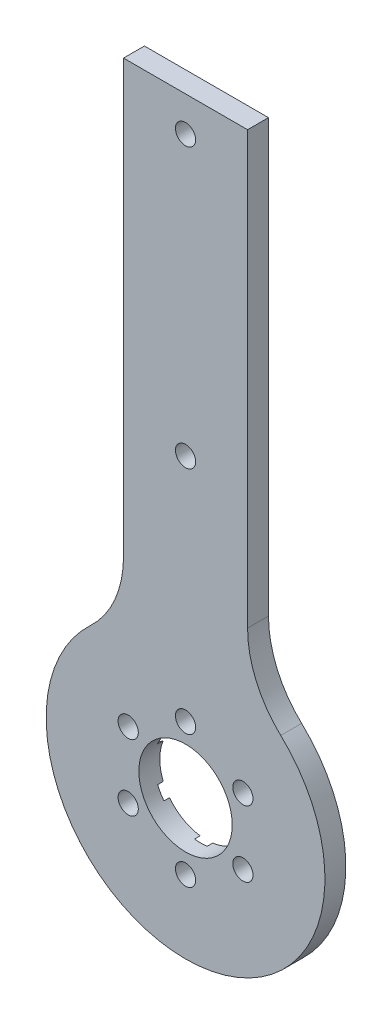
ISO-10303-21;
HEADER;
FILE_DESCRIPTION(('STEP AP214'),'2;1');
FILE_NAME('part.step','',(''),(''),'','','');
FILE_SCHEMA(('AUTOMOTIVE_DESIGN { 1 0 10303 214 1 1 1 1 }'));
ENDSEC;
DATA;
#1=APPLICATION_CONTEXT('core data for automotive mechanical design processes');
#2=APPLICATION_PROTOCOL_DEFINITION('international standard','automotive_design',2000,#1);
#3=PRODUCT_CONTEXT('',#1,'mechanical');
#4=PRODUCT('Part','Part','',(#3));
#5=PRODUCT_RELATED_PRODUCT_CATEGORY('part','',(#4));
#6=PRODUCT_DEFINITION_FORMATION('','',#4);
#7=PRODUCT_DEFINITION_CONTEXT('part definition',#1,'design');
#8=PRODUCT_DEFINITION('design','',#6,#7);
#9=PRODUCT_DEFINITION_SHAPE('','',#8);
#10=(LENGTH_UNIT() NAMED_UNIT(*) SI_UNIT(.MILLI.,.METRE.));
#11=(NAMED_UNIT(*) PLANE_ANGLE_UNIT() SI_UNIT($,.RADIAN.));
#12=(NAMED_UNIT(*) SI_UNIT($,.STERADIAN.) SOLID_ANGLE_UNIT());
#13=UNCERTAINTY_MEASURE_WITH_UNIT(LENGTH_MEASURE(1.E-05),#10,'distance_accuracy_value','');
#14=(GEOMETRIC_REPRESENTATION_CONTEXT(3) GLOBAL_UNCERTAINTY_ASSIGNED_CONTEXT((#13)) GLOBAL_UNIT_ASSIGNED_CONTEXT((#10,
#11,#12)) REPRESENTATION_CONTEXT('',''));
#15=CARTESIAN_POINT('',(0.,0.,0.));
#16=DIRECTION('',(0.,0.,1.));
#17=DIRECTION('',(1.,0.,0.));
#18=AXIS2_PLACEMENT_3D('',#15,#16,#17);
#19=CARTESIAN_POINT('',(0.,9.5,-3.));
#20=DIRECTION('',(0.,0.,1.));
#21=DIRECTION('',(-1.,0.,0.));
#22=AXIS2_PLACEMENT_3D('',#19,#20,#21);
#23=CYLINDRICAL_SURFACE('',#22,1.45);
#24=CARTESIAN_POINT('',(0.,9.5,0.));
#25=DIRECTION('',(0.,0.,1.));
#26=DIRECTION('',(1.,0.,0.));
#27=AXIS2_PLACEMENT_3D('',#24,#25,#26);
#28=CIRCLE('',#27,1.45);
#29=CARTESIAN_POINT('',(1.45,9.5,0.));
#30=VERTEX_POINT('',#29);
#31=EDGE_CURVE('E292',#30,#30,#28,.T.);
#32=ORIENTED_EDGE('',*,*,#31,.T.);
#33=EDGE_LOOP('',(#32));
#34=FACE_BOUND('',#33,.T.);
#35=CARTESIAN_POINT('',(0.,9.5,-2.2));
#36=DIRECTION('',(0.,0.,1.));
#37=DIRECTION('',(1.,0.,0.));
#38=AXIS2_PLACEMENT_3D('',#35,#36,#37);
#39=CIRCLE('',#38,1.45);
#40=CARTESIAN_POINT('',(1.45,9.5,-2.2));
#41=VERTEX_POINT('',#40);
#42=EDGE_CURVE('E239',#41,#41,#39,.T.);
#43=ORIENTED_EDGE('',*,*,#42,.F.);
#44=EDGE_LOOP('',(#43));
#45=FACE_BOUND('',#44,.T.);
#46=ADVANCED_FACE('F43',(#34,#45),#23,.F.);
#47=CARTESIAN_POINT('',(8.22724133595217,4.75,-3.));
#48=DIRECTION('',(0.,0.,1.));
#49=DIRECTION('',(-1.,0.,0.));
#50=AXIS2_PLACEMENT_3D('',#47,#48,#49);
#51=CYLINDRICAL_SURFACE('',#50,1.45);
#52=CARTESIAN_POINT('',(8.22724133595217,4.75,0.));
#53=DIRECTION('',(0.,0.,1.));
#54=DIRECTION('',(1.,0.,0.));
#55=AXIS2_PLACEMENT_3D('',#52,#53,#54);
#56=CIRCLE('',#55,1.45);
#57=CARTESIAN_POINT('',(9.67724133595217,4.75,0.));
#58=VERTEX_POINT('',#57);
#59=EDGE_CURVE('E289',#58,#58,#56,.T.);
#60=ORIENTED_EDGE('',*,*,#59,.T.);
#61=EDGE_LOOP('',(#60));
#62=FACE_BOUND('',#61,.T.);
#63=CARTESIAN_POINT('',(8.22724133595217,4.75,-2.2));
#64=DIRECTION('',(0.,0.,1.));
#65=DIRECTION('',(1.,0.,0.));
#66=AXIS2_PLACEMENT_3D('',#63,#64,#65);
#67=CIRCLE('',#66,1.45);
#68=CARTESIAN_POINT('',(9.67724133595217,4.75,-2.2));
#69=VERTEX_POINT('',#68);
#70=EDGE_CURVE('E236',#69,#69,#67,.T.);
#71=ORIENTED_EDGE('',*,*,#70,.F.);
#72=EDGE_LOOP('',(#71));
#73=FACE_BOUND('',#72,.T.);
#74=ADVANCED_FACE('F392',(#62,#73),#51,.F.);
#75=CARTESIAN_POINT('',(8.22724133595217,-4.75,-3.));
#76=DIRECTION('',(0.,0.,1.));
#77=DIRECTION('',(-1.,0.,0.));
#78=AXIS2_PLACEMENT_3D('',#75,#76,#77);
#79=CYLINDRICAL_SURFACE('',#78,1.45);
#80=CARTESIAN_POINT('',(8.22724133595217,-4.75,0.));
#81=DIRECTION('',(0.,0.,1.));
#82=DIRECTION('',(1.,0.,0.));
#83=AXIS2_PLACEMENT_3D('',#80,#81,#82);
#84=CIRCLE('',#83,1.45);
#85=CARTESIAN_POINT('',(9.67724133595217,-4.75,0.));
#86=VERTEX_POINT('',#85);
#87=EDGE_CURVE('E286',#86,#86,#84,.T.);
#88=ORIENTED_EDGE('',*,*,#87,.T.);
#89=EDGE_LOOP('',(#88));
#90=FACE_BOUND('',#89,.T.);
#91=CARTESIAN_POINT('',(8.22724133595217,-4.75,-2.2));
#92=DIRECTION('',(0.,0.,1.));
#93=DIRECTION('',(1.,0.,0.));
#94=AXIS2_PLACEMENT_3D('',#91,#92,#93);
#95=CIRCLE('',#94,1.45);
#96=CARTESIAN_POINT('',(9.67724133595217,-4.75,-2.2));
#97=VERTEX_POINT('',#96);
#98=EDGE_CURVE('E233',#97,#97,#95,.T.);
#99=ORIENTED_EDGE('',*,*,#98,.F.);
#100=EDGE_LOOP('',(#99));
#101=FACE_BOUND('',#100,.T.);
#102=ADVANCED_FACE('F398',(#90,#101),#79,.F.);
#103=CARTESIAN_POINT('',(0.,-9.5,-3.));
#104=DIRECTION('',(0.,0.,1.));
#105=DIRECTION('',(-1.,0.,0.));
#106=AXIS2_PLACEMENT_3D('',#103,#104,#105);
#107=CYLINDRICAL_SURFACE('',#106,1.45);
#108=CARTESIAN_POINT('',(0.,-9.5,0.));
#109=DIRECTION('',(0.,0.,1.));
#110=DIRECTION('',(1.,0.,0.));
#111=AXIS2_PLACEMENT_3D('',#108,#109,#110);
#112=CIRCLE('',#111,1.45);
#113=CARTESIAN_POINT('',(1.45,-9.5,0.));
#114=VERTEX_POINT('',#113);
#115=EDGE_CURVE('E283',#114,#114,#112,.T.);
#116=ORIENTED_EDGE('',*,*,#115,.T.);
#117=EDGE_LOOP('',(#116));
#118=FACE_BOUND('',#117,.T.);
#119=CARTESIAN_POINT('',(0.,-9.5,-2.2));
#120=DIRECTION('',(0.,0.,1.));
#121=DIRECTION('',(1.,0.,0.));
#122=AXIS2_PLACEMENT_3D('',#119,#120,#121);
#123=CIRCLE('',#122,1.45);
#124=CARTESIAN_POINT('',(1.45,-9.5,-2.2));
#125=VERTEX_POINT('',#124);
#126=EDGE_CURVE('E229',#125,#125,#123,.T.);
#127=ORIENTED_EDGE('',*,*,#126,.F.);
#128=EDGE_LOOP('',(#127));
#129=FACE_BOUND('',#128,.T.);
#130=ADVANCED_FACE('F466',(#118,#129),#107,.F.);
#131=CARTESIAN_POINT('',(-8.22724133595217,-4.75,-3.));
#132=DIRECTION('',(0.,0.,1.));
#133=DIRECTION('',(-1.,0.,0.));
#134=AXIS2_PLACEMENT_3D('',#131,#132,#133);
#135=CYLINDRICAL_SURFACE('',#134,1.45);
#136=CARTESIAN_POINT('',(-8.22724133595217,-4.75,0.));
#137=DIRECTION('',(0.,0.,1.));
#138=DIRECTION('',(1.,0.,0.));
#139=AXIS2_PLACEMENT_3D('',#136,#137,#138);
#140=CIRCLE('',#139,1.45);
#141=CARTESIAN_POINT('',(-6.77724133595216,-4.75,0.));
#142=VERTEX_POINT('',#141);
#143=EDGE_CURVE('E280',#142,#142,#140,.T.);
#144=ORIENTED_EDGE('',*,*,#143,.T.);
#145=EDGE_LOOP('',(#144));
#146=FACE_BOUND('',#145,.T.);
#147=CARTESIAN_POINT('',(-8.22724133595217,-4.75,-2.2));
#148=DIRECTION('',(0.,0.,1.));
#149=DIRECTION('',(1.,0.,0.));
#150=AXIS2_PLACEMENT_3D('',#147,#148,#149);
#151=CIRCLE('',#150,1.45);
#152=CARTESIAN_POINT('',(-6.77724133595216,-4.75,-2.2));
#153=VERTEX_POINT('',#152);
#154=EDGE_CURVE('E225',#153,#153,#151,.T.);
#155=ORIENTED_EDGE('',*,*,#154,.F.);
#156=EDGE_LOOP('',(#155));
#157=FACE_BOUND('',#156,.T.);
#158=ADVANCED_FACE('F462',(#146,#157),#135,.F.);
#159=CARTESIAN_POINT('',(-8.22724133595217,4.75,-3.));
#160=DIRECTION('',(0.,0.,1.));
#161=DIRECTION('',(-1.,0.,0.));
#162=AXIS2_PLACEMENT_3D('',#159,#160,#161);
#163=CYLINDRICAL_SURFACE('',#162,1.45);
#164=CARTESIAN_POINT('',(-8.22724133595217,4.75,0.));
#165=DIRECTION('',(0.,0.,1.));
#166=DIRECTION('',(1.,0.,0.));
#167=AXIS2_PLACEMENT_3D('',#164,#165,#166);
#168=CIRCLE('',#167,1.45);
#169=CARTESIAN_POINT('',(-6.77724133595217,4.75,0.));
#170=VERTEX_POINT('',#169);
#171=EDGE_CURVE('E277',#170,#170,#168,.T.);
#172=ORIENTED_EDGE('',*,*,#171,.T.);
#173=EDGE_LOOP('',(#172));
#174=FACE_BOUND('',#173,.T.);
#175=CARTESIAN_POINT('',(-8.22724133595217,4.75,-2.2));
#176=DIRECTION('',(0.,0.,1.));
#177=DIRECTION('',(1.,0.,0.));
#178=AXIS2_PLACEMENT_3D('',#175,#176,#177);
#179=CIRCLE('',#178,1.45);
#180=CARTESIAN_POINT('',(-6.77724133595217,4.75,-2.2));
#181=VERTEX_POINT('',#180);
#182=EDGE_CURVE('E221',#181,#181,#179,.T.);
#183=ORIENTED_EDGE('',*,*,#182,.F.);
#184=EDGE_LOOP('',(#183));
#185=FACE_BOUND('',#184,.T.);
#186=ADVANCED_FACE('F415',(#174,#185),#163,.F.);
#187=CARTESIAN_POINT('',(0.,0.,-3.));
#188=DIRECTION('',(0.,0.,1.));
#189=DIRECTION('',(-1.,0.,0.));
#190=AXIS2_PLACEMENT_3D('',#187,#188,#189);
#191=CYLINDRICAL_SURFACE('',#190,20.);
#192=CARTESIAN_POINT('',(0.,0.,-3.));
#193=DIRECTION('',(0.,0.,1.));
#194=DIRECTION('',(1.,0.,0.));
#195=AXIS2_PLACEMENT_3D('',#192,#193,#194);
#196=CIRCLE('',#195,20.);
#197=CARTESIAN_POINT('',(-13.6571428571429,14.6110386003046,-3.));
#198=VERTEX_POINT('',#197);
#199=CARTESIAN_POINT('',(13.6571428571429,14.6110386003046,-3.));
#200=VERTEX_POINT('',#199);
#201=EDGE_CURVE('E302',#198,#200,#196,.T.);
#202=ORIENTED_EDGE('',*,*,#201,.T.);
#203=DIRECTION('',(0.,0.,1.));
#204=VECTOR('',#203,1.);
#205=CARTESIAN_POINT('',(13.6571428571429,14.6110386003046,-3.));
#206=LINE('',#205,#204);
#207=CARTESIAN_POINT('',(13.6571428571429,14.6110386003046,0.));
#208=VERTEX_POINT('',#207);
#209=EDGE_CURVE('E310',#208,#200,#206,.F.);
#210=ORIENTED_EDGE('',*,*,#209,.F.);
#211=CARTESIAN_POINT('',(0.,0.,0.));
#212=DIRECTION('',(0.,0.,1.));
#213=DIRECTION('',(1.,0.,0.));
#214=AXIS2_PLACEMENT_3D('',#211,#212,#213);
#215=CIRCLE('',#214,20.);
#216=CARTESIAN_POINT('',(-13.6571428571429,14.6110386003046,0.));
#217=VERTEX_POINT('',#216);
#218=EDGE_CURVE('E306',#217,#208,#215,.T.);
#219=ORIENTED_EDGE('',*,*,#218,.F.);
#220=DIRECTION('',(0.,0.,1.));
#221=VECTOR('',#220,1.);
#222=CARTESIAN_POINT('',(-13.6571428571429,14.6110386003046,-3.));
#223=LINE('',#222,#221);
#224=EDGE_CURVE('E313',#198,#217,#223,.T.);
#225=ORIENTED_EDGE('',*,*,#224,.F.);
#226=EDGE_LOOP('',(#202,#210,#219,#225));
#227=FACE_BOUND('',#226,.T.);
#228=ADVANCED_FACE('F410',(#227),#191,.T.);
#229=CARTESIAN_POINT('',(0.,0.,-3.));
#230=DIRECTION('',(0.,0.,-1.));
#231=DIRECTION('',(1.,0.,0.));
#232=AXIS2_PLACEMENT_3D('',#229,#230,#231);
#233=PLANE('',#232);
#234=CARTESIAN_POINT('',(8.22724133595217,4.75,-3.));
#235=DIRECTION('',(0.,0.,1.));
#236=DIRECTION('',(1.,0.,0.));
#237=AXIS2_PLACEMENT_3D('',#234,#235,#236);
#238=CIRCLE('',#237,3.);
#239=CARTESIAN_POINT('',(6.20071150321712,2.53794737019327,-3.));
#240=VERTEX_POINT('',#239);
#241=CARTESIAN_POINT('',(5.29828264766384,4.10099999822778,-3.));
#242=VERTEX_POINT('',#241);
#243=EDGE_CURVE('E205',#240,#242,#238,.T.);
#244=ORIENTED_EDGE('',*,*,#243,.T.);
#245=CARTESIAN_POINT('',(0.,0.,-3.));
#246=DIRECTION('',(0.,0.,1.));
#247=DIRECTION('',(1.,0.,0.));
#248=AXIS2_PLACEMENT_3D('',#245,#246,#247);
#249=CIRCLE('',#248,6.7);
#250=CARTESIAN_POINT('',(0.902428855553269,6.63894736842105,-3.));
#251=VERTEX_POINT('',#250);
#252=EDGE_CURVE('E299',#242,#251,#249,.T.);
#253=ORIENTED_EDGE('',*,*,#252,.T.);
#254=CARTESIAN_POINT('',(0.,9.5,-3.));
#255=DIRECTION('',(0.,0.,1.));
#256=DIRECTION('',(1.,0.,0.));
#257=AXIS2_PLACEMENT_3D('',#254,#255,#256);
#258=CIRCLE('',#257,3.);
#259=CARTESIAN_POINT('',(-0.902428855553269,6.63894736842105,-3.));
#260=VERTEX_POINT('',#259);
#261=EDGE_CURVE('E207',#251,#260,#258,.T.);
#262=ORIENTED_EDGE('',*,*,#261,.T.);
#263=CARTESIAN_POINT('',(-5.29828264766384,4.10099999822778,-3.));
#264=VERTEX_POINT('',#263);
#265=EDGE_CURVE('E191',#260,#264,#249,.T.);
#266=ORIENTED_EDGE('',*,*,#265,.T.);
#267=CARTESIAN_POINT('',(-8.22724133595217,4.75,-3.));
#268=DIRECTION('',(0.,0.,1.));
#269=DIRECTION('',(1.,0.,0.));
#270=AXIS2_PLACEMENT_3D('',#267,#268,#269);
#271=CIRCLE('',#270,3.);
#272=CARTESIAN_POINT('',(-6.20071150321711,2.53794737019328,-3.));
#273=VERTEX_POINT('',#272);
#274=EDGE_CURVE('E172',#264,#273,#271,.T.);
#275=ORIENTED_EDGE('',*,*,#274,.T.);
#276=CARTESIAN_POINT('',(-6.20071150321711,-2.53794737019328,-3.));
#277=VERTEX_POINT('',#276);
#278=EDGE_CURVE('E182',#273,#277,#249,.T.);
#279=ORIENTED_EDGE('',*,*,#278,.T.);
#280=CARTESIAN_POINT('',(-8.22724133595217,-4.75,-3.));
#281=DIRECTION('',(0.,0.,1.));
#282=DIRECTION('',(1.,0.,0.));
#283=AXIS2_PLACEMENT_3D('',#280,#281,#282);
#284=CIRCLE('',#283,3.);
#285=CARTESIAN_POINT('',(-5.29828264766384,-4.10099999822778,-3.));
#286=VERTEX_POINT('',#285);
#287=EDGE_CURVE('E201',#277,#286,#284,.T.);
#288=ORIENTED_EDGE('',*,*,#287,.T.);
#289=CARTESIAN_POINT('',(-0.902428855553268,-6.63894736842105,-3.));
#290=VERTEX_POINT('',#289);
#291=EDGE_CURVE('E192',#286,#290,#249,.T.);
#292=ORIENTED_EDGE('',*,*,#291,.T.);
#293=CARTESIAN_POINT('',(0.,-9.5,-3.));
#294=DIRECTION('',(0.,0.,1.));
#295=DIRECTION('',(1.,0.,0.));
#296=AXIS2_PLACEMENT_3D('',#293,#294,#295);
#297=CIRCLE('',#296,3.);
#298=CARTESIAN_POINT('',(0.90242885555327,-6.63894736842105,-3.));
#299=VERTEX_POINT('',#298);
#300=EDGE_CURVE('E213',#290,#299,#297,.T.);
#301=ORIENTED_EDGE('',*,*,#300,.T.);
#302=CARTESIAN_POINT('',(5.29828264766384,-4.10099999822778,-3.));
#303=VERTEX_POINT('',#302);
#304=EDGE_CURVE('E298',#299,#303,#249,.T.);
#305=ORIENTED_EDGE('',*,*,#304,.T.);
#306=CARTESIAN_POINT('',(8.22724133595217,-4.75,-3.));
#307=DIRECTION('',(0.,0.,1.));
#308=DIRECTION('',(1.,0.,0.));
#309=AXIS2_PLACEMENT_3D('',#306,#307,#308);
#310=CIRCLE('',#309,3.);
#311=CARTESIAN_POINT('',(6.20071150321712,-2.53794737019327,-3.));
#312=VERTEX_POINT('',#311);
#313=EDGE_CURVE('E209',#303,#312,#310,.T.);
#314=ORIENTED_EDGE('',*,*,#313,.T.);
#315=EDGE_CURVE('E295',#312,#240,#249,.T.);
#316=ORIENTED_EDGE('',*,*,#315,.T.);
#317=EDGE_LOOP('',(#244,#253,#262,#266,#275,#279,#288,#292,#301,#305,#314,#316));
#318=FACE_BOUND('',#317,.T.);
#319=DIRECTION('',(0.,-1.,0.));
#320=VECTOR('',#319,1.);
#321=CARTESIAN_POINT('',(-8.9,12.5,-3.));
#322=LINE('',#321,#320);
#323=CARTESIAN_POINT('',(-8.9,87.5,-3.));
#324=VERTEX_POINT('',#323);
#325=CARTESIAN_POINT('',(-8.9,25.5693175505331,-3.));
#326=VERTEX_POINT('',#325);
#327=EDGE_CURVE('E263',#324,#326,#322,.T.);
#328=ORIENTED_EDGE('',*,*,#327,.F.);
#329=DIRECTION('',(-1.,0.,0.));
#330=VECTOR('',#329,1.);
#331=CARTESIAN_POINT('',(-8.9,87.5,-3.));
#332=LINE('',#331,#330);
#333=CARTESIAN_POINT('',(8.9,87.5,-3.));
#334=VERTEX_POINT('',#333);
#335=EDGE_CURVE('E259',#334,#324,#332,.T.);
#336=ORIENTED_EDGE('',*,*,#335,.F.);
#337=DIRECTION('',(0.,1.,0.));
#338=VECTOR('',#337,1.);
#339=CARTESIAN_POINT('',(8.9,12.5,-3.));
#340=LINE('',#339,#338);
#341=CARTESIAN_POINT('',(8.9,25.5693175505331,-3.));
#342=VERTEX_POINT('',#341);
#343=EDGE_CURVE('E256',#342,#334,#340,.T.);
#344=ORIENTED_EDGE('',*,*,#343,.F.);
#345=CARTESIAN_POINT('',(23.9,25.5693175505331,-3.));
#346=DIRECTION('',(0.,0.,1.));
#347=DIRECTION('',(1.,0.,0.));
#348=AXIS2_PLACEMENT_3D('',#345,#346,#347);
#349=CIRCLE('',#348,15.);
#350=EDGE_CURVE('E325',#200,#342,#349,.F.);
#351=ORIENTED_EDGE('',*,*,#350,.F.);
#352=ORIENTED_EDGE('',*,*,#201,.F.);
#353=CARTESIAN_POINT('',(-23.9,25.5693175505331,-3.));
#354=DIRECTION('',(0.,0.,1.));
#355=DIRECTION('',(1.,0.,0.));
#356=AXIS2_PLACEMENT_3D('',#353,#354,#355);
#357=CIRCLE('',#356,15.);
#358=EDGE_CURVE('E318',#326,#198,#357,.F.);
#359=ORIENTED_EDGE('',*,*,#358,.F.);
#360=EDGE_LOOP('',(#328,#336,#344,#351,#352,#359));
#361=FACE_BOUND('',#360,.T.);
#362=CARTESIAN_POINT('',(0.,42.5,-3.));
#363=DIRECTION('',(0.,0.,1.));
#364=DIRECTION('',(1.,0.,0.));
#365=AXIS2_PLACEMENT_3D('',#362,#363,#364);
#366=CIRCLE('',#365,1.45);
#367=CARTESIAN_POINT('',(1.45,42.5,-3.));
#368=VERTEX_POINT('',#367);
#369=EDGE_CURVE('E250',#368,#368,#366,.T.);
#370=ORIENTED_EDGE('',*,*,#369,.T.);
#371=EDGE_LOOP('',(#370));
#372=FACE_BOUND('',#371,.T.);
#373=CARTESIAN_POINT('',(0.,82.5,-3.));
#374=DIRECTION('',(0.,0.,1.));
#375=DIRECTION('',(1.,0.,0.));
#376=AXIS2_PLACEMENT_3D('',#373,#374,#375);
#377=CIRCLE('',#376,1.45);
#378=CARTESIAN_POINT('',(1.45,82.5,-3.));
#379=VERTEX_POINT('',#378);
#380=EDGE_CURVE('E244',#379,#379,#377,.T.);
#381=ORIENTED_EDGE('',*,*,#380,.T.);
#382=EDGE_LOOP('',(#381));
#383=FACE_BOUND('',#382,.T.);
#384=ADVANCED_FACE('F195',(#318,#361,#372,#383),#233,.T.);
#385=CARTESIAN_POINT('',(0.,0.,0.));
#386=DIRECTION('',(0.,0.,-1.));
#387=DIRECTION('',(1.,0.,0.));
#388=AXIS2_PLACEMENT_3D('',#385,#386,#387);
#389=PLANE('',#388);
#390=ORIENTED_EDGE('',*,*,#218,.T.);
#391=CARTESIAN_POINT('',(23.9,25.5693175505331,0.));
#392=DIRECTION('',(0.,0.,1.));
#393=DIRECTION('',(1.,0.,0.));
#394=AXIS2_PLACEMENT_3D('',#391,#392,#393);
#395=CIRCLE('',#394,15.);
#396=CARTESIAN_POINT('',(8.9,25.5693175505331,0.));
#397=VERTEX_POINT('',#396);
#398=EDGE_CURVE('E323',#397,#208,#395,.T.);
#399=ORIENTED_EDGE('',*,*,#398,.F.);
#400=DIRECTION('',(0.,1.,0.));
#401=VECTOR('',#400,1.);
#402=CARTESIAN_POINT('',(8.9,12.5,0.));
#403=LINE('',#402,#401);
#404=CARTESIAN_POINT('',(8.9,87.5,0.));
#405=VERTEX_POINT('',#404);
#406=EDGE_CURVE('E253',#397,#405,#403,.T.);
#407=ORIENTED_EDGE('',*,*,#406,.T.);
#408=DIRECTION('',(-1.,0.,0.));
#409=VECTOR('',#408,1.);
#410=CARTESIAN_POINT('',(-8.9,87.5,0.));
#411=LINE('',#410,#409);
#412=CARTESIAN_POINT('',(-8.9,87.5,0.));
#413=VERTEX_POINT('',#412);
#414=EDGE_CURVE('E269',#405,#413,#411,.T.);
#415=ORIENTED_EDGE('',*,*,#414,.T.);
#416=DIRECTION('',(0.,-1.,0.));
#417=VECTOR('',#416,1.);
#418=CARTESIAN_POINT('',(-8.9,12.5,0.));
#419=LINE('',#418,#417);
#420=CARTESIAN_POINT('',(-8.9,25.5693175505331,0.));
#421=VERTEX_POINT('',#420);
#422=EDGE_CURVE('E260',#413,#421,#419,.T.);
#423=ORIENTED_EDGE('',*,*,#422,.T.);
#424=CARTESIAN_POINT('',(-23.9,25.5693175505331,0.));
#425=DIRECTION('',(0.,0.,1.));
#426=DIRECTION('',(1.,0.,0.));
#427=AXIS2_PLACEMENT_3D('',#424,#425,#426);
#428=CIRCLE('',#427,15.);
#429=EDGE_CURVE('E320',#217,#421,#428,.T.);
#430=ORIENTED_EDGE('',*,*,#429,.F.);
#431=EDGE_LOOP('',(#390,#399,#407,#415,#423,#430));
#432=FACE_BOUND('',#431,.T.);
#433=CARTESIAN_POINT('',(0.,42.5,0.));
#434=DIRECTION('',(0.,0.,1.));
#435=DIRECTION('',(1.,0.,0.));
#436=AXIS2_PLACEMENT_3D('',#433,#434,#435);
#437=CIRCLE('',#436,1.45);
#438=CARTESIAN_POINT('',(1.45,42.5,0.));
#439=VERTEX_POINT('',#438);
#440=EDGE_CURVE('E247',#439,#439,#437,.T.);
#441=ORIENTED_EDGE('',*,*,#440,.F.);
#442=EDGE_LOOP('',(#441));
#443=FACE_BOUND('',#442,.T.);
#444=CARTESIAN_POINT('',(0.,82.5,0.));
#445=DIRECTION('',(0.,0.,1.));
#446=DIRECTION('',(1.,0.,0.));
#447=AXIS2_PLACEMENT_3D('',#444,#445,#446);
#448=CIRCLE('',#447,1.45);
#449=CARTESIAN_POINT('',(1.45,82.5,0.));
#450=VERTEX_POINT('',#449);
#451=EDGE_CURVE('E243',#450,#450,#448,.T.);
#452=ORIENTED_EDGE('',*,*,#451,.F.);
#453=EDGE_LOOP('',(#452));
#454=FACE_BOUND('',#453,.T.);
#455=ORIENTED_EDGE('',*,*,#171,.F.);
#456=EDGE_LOOP('',(#455));
#457=FACE_BOUND('',#456,.T.);
#458=ORIENTED_EDGE('',*,*,#143,.F.);
#459=EDGE_LOOP('',(#458));
#460=FACE_BOUND('',#459,.T.);
#461=ORIENTED_EDGE('',*,*,#115,.F.);
#462=EDGE_LOOP('',(#461));
#463=FACE_BOUND('',#462,.T.);
#464=ORIENTED_EDGE('',*,*,#87,.F.);
#465=EDGE_LOOP('',(#464));
#466=FACE_BOUND('',#465,.T.);
#467=ORIENTED_EDGE('',*,*,#59,.F.);
#468=EDGE_LOOP('',(#467));
#469=FACE_BOUND('',#468,.T.);
#470=ORIENTED_EDGE('',*,*,#31,.F.);
#471=EDGE_LOOP('',(#470));
#472=FACE_BOUND('',#471,.T.);
#473=CARTESIAN_POINT('',(0.,0.,0.));
#474=DIRECTION('',(0.,0.,1.));
#475=DIRECTION('',(1.,0.,0.));
#476=AXIS2_PLACEMENT_3D('',#473,#474,#475);
#477=CIRCLE('',#476,6.7);
#478=CARTESIAN_POINT('',(6.7,0.,0.));
#479=VERTEX_POINT('',#478);
#480=EDGE_CURVE('E294',#479,#479,#477,.T.);
#481=ORIENTED_EDGE('',*,*,#480,.F.);
#482=EDGE_LOOP('',(#481));
#483=FACE_BOUND('',#482,.T.);
#484=ADVANCED_FACE('F407',(#432,#443,#454,#457,#460,#463,#466,#469,#472,#483),#389,.F.);
#485=CARTESIAN_POINT('',(0.,0.,-3.));
#486=DIRECTION('',(0.,0.,1.));
#487=DIRECTION('',(-1.,0.,0.));
#488=AXIS2_PLACEMENT_3D('',#485,#486,#487);
#489=CYLINDRICAL_SURFACE('',#488,6.7);
#490=DIRECTION('',(0.,0.,-1.));
#491=VECTOR('',#490,1.);
#492=CARTESIAN_POINT('',(6.20071150321712,2.53794737019327,-2.6));
#493=LINE('',#492,#491);
#494=CARTESIAN_POINT('',(6.20071150321712,2.53794737019327,-2.2));
#495=VERTEX_POINT('',#494);
#496=EDGE_CURVE('E11',#495,#240,#493,.T.);
#497=ORIENTED_EDGE('',*,*,#496,.T.);
#498=ORIENTED_EDGE('',*,*,#315,.F.);
#499=DIRECTION('',(0.,0.,-1.));
#500=VECTOR('',#499,1.);
#501=CARTESIAN_POINT('',(6.20071150321712,-2.53794737019327,-2.6));
#502=LINE('',#501,#500);
#503=CARTESIAN_POINT('',(6.20071150321712,-2.53794737019327,-2.2));
#504=VERTEX_POINT('',#503);
#505=EDGE_CURVE('E354',#312,#504,#502,.F.);
#506=ORIENTED_EDGE('',*,*,#505,.T.);
#507=CARTESIAN_POINT('',(0.,0.,-2.2));
#508=DIRECTION('',(0.,0.,1.));
#509=DIRECTION('',(1.,0.,0.));
#510=AXIS2_PLACEMENT_3D('',#507,#508,#509);
#511=CIRCLE('',#510,6.7);
#512=CARTESIAN_POINT('',(5.29828264766384,-4.10099999822778,-2.2));
#513=VERTEX_POINT('',#512);
#514=EDGE_CURVE('E234',#513,#504,#511,.T.);
#515=ORIENTED_EDGE('',*,*,#514,.F.);
#516=DIRECTION('',(0.,0.,-1.));
#517=VECTOR('',#516,1.);
#518=CARTESIAN_POINT('',(5.29828264766384,-4.10099999822778,-2.6));
#519=LINE('',#518,#517);
#520=EDGE_CURVE('E357',#513,#303,#519,.T.);
#521=ORIENTED_EDGE('',*,*,#520,.T.);
#522=ORIENTED_EDGE('',*,*,#304,.F.);
#523=DIRECTION('',(0.,0.,-1.));
#524=VECTOR('',#523,1.);
#525=CARTESIAN_POINT('',(0.902428855553269,-6.63894736842105,-2.6));
#526=LINE('',#525,#524);
#527=CARTESIAN_POINT('',(0.90242885555327,-6.63894736842105,-2.2));
#528=VERTEX_POINT('',#527);
#529=EDGE_CURVE('E349',#299,#528,#526,.F.);
#530=ORIENTED_EDGE('',*,*,#529,.T.);
#531=CARTESIAN_POINT('',(0.,0.,-2.2));
#532=DIRECTION('',(0.,0.,1.));
#533=DIRECTION('',(1.,0.,0.));
#534=AXIS2_PLACEMENT_3D('',#531,#532,#533);
#535=CIRCLE('',#534,6.7);
#536=CARTESIAN_POINT('',(-0.902428855553268,-6.63894736842105,-2.2));
#537=VERTEX_POINT('',#536);
#538=EDGE_CURVE('E230',#537,#528,#535,.T.);
#539=ORIENTED_EDGE('',*,*,#538,.F.);
#540=DIRECTION('',(0.,0.,-1.));
#541=VECTOR('',#540,1.);
#542=CARTESIAN_POINT('',(-0.902428855553267,-6.63894736842105,-2.6));
#543=LINE('',#542,#541);
#544=EDGE_CURVE('E352',#537,#290,#543,.T.);
#545=ORIENTED_EDGE('',*,*,#544,.T.);
#546=ORIENTED_EDGE('',*,*,#291,.F.);
#547=DIRECTION('',(0.,0.,-1.));
#548=VECTOR('',#547,1.);
#549=CARTESIAN_POINT('',(-5.29828264766384,-4.10099999822778,-2.6));
#550=LINE('',#549,#548);
#551=CARTESIAN_POINT('',(-5.29828264766384,-4.10099999822778,-2.2));
#552=VERTEX_POINT('',#551);
#553=EDGE_CURVE('E345',#286,#552,#550,.F.);
#554=ORIENTED_EDGE('',*,*,#553,.T.);
#555=CARTESIAN_POINT('',(0.,0.,-2.2));
#556=DIRECTION('',(0.,0.,1.));
#557=DIRECTION('',(1.,0.,0.));
#558=AXIS2_PLACEMENT_3D('',#555,#556,#557);
#559=CIRCLE('',#558,6.7);
#560=CARTESIAN_POINT('',(-6.20071150321711,-2.53794737019328,-2.2));
#561=VERTEX_POINT('',#560);
#562=EDGE_CURVE('E226',#561,#552,#559,.T.);
#563=ORIENTED_EDGE('',*,*,#562,.F.);
#564=DIRECTION('',(0.,0.,-1.));
#565=VECTOR('',#564,1.);
#566=CARTESIAN_POINT('',(-6.20071150321711,-2.53794737019328,-2.6));
#567=LINE('',#566,#565);
#568=EDGE_CURVE('E187',#561,#277,#567,.T.);
#569=ORIENTED_EDGE('',*,*,#568,.T.);
#570=ORIENTED_EDGE('',*,*,#278,.F.);
#571=DIRECTION('',(0.,0.,-1.));
#572=VECTOR('',#571,1.);
#573=CARTESIAN_POINT('',(-6.20071150321711,2.53794737019328,-2.6));
#574=LINE('',#573,#572);
#575=CARTESIAN_POINT('',(-6.20071150321711,2.53794737019328,-2.2));
#576=VERTEX_POINT('',#575);
#577=EDGE_CURVE('E167',#273,#576,#574,.F.);
#578=ORIENTED_EDGE('',*,*,#577,.T.);
#579=CARTESIAN_POINT('',(0.,0.,-2.2));
#580=DIRECTION('',(0.,0.,1.));
#581=DIRECTION('',(1.,0.,0.));
#582=AXIS2_PLACEMENT_3D('',#579,#580,#581);
#583=CIRCLE('',#582,6.7);
#584=CARTESIAN_POINT('',(-5.29828264766384,4.10099999822778,-2.2));
#585=VERTEX_POINT('',#584);
#586=EDGE_CURVE('E223',#585,#576,#583,.T.);
#587=ORIENTED_EDGE('',*,*,#586,.F.);
#588=DIRECTION('',(0.,0.,-1.));
#589=VECTOR('',#588,1.);
#590=CARTESIAN_POINT('',(-5.29828264766384,4.10099999822777,-2.6));
#591=LINE('',#590,#589);
#592=EDGE_CURVE('E178',#585,#264,#591,.T.);
#593=ORIENTED_EDGE('',*,*,#592,.T.);
#594=ORIENTED_EDGE('',*,*,#265,.F.);
#595=DIRECTION('',(0.,0.,-1.));
#596=VECTOR('',#595,1.);
#597=CARTESIAN_POINT('',(-0.902428855553271,6.63894736842105,-2.6));
#598=LINE('',#597,#596);
#599=CARTESIAN_POINT('',(-0.902428855553269,6.63894736842105,-2.2));
#600=VERTEX_POINT('',#599);
#601=EDGE_CURVE('E328',#260,#600,#598,.F.);
#602=ORIENTED_EDGE('',*,*,#601,.T.);
#603=CARTESIAN_POINT('',(0.,0.,-2.2));
#604=DIRECTION('',(0.,0.,1.));
#605=DIRECTION('',(1.,0.,0.));
#606=AXIS2_PLACEMENT_3D('',#603,#604,#605);
#607=CIRCLE('',#606,6.7);
#608=CARTESIAN_POINT('',(0.902428855553269,6.63894736842105,-2.2));
#609=VERTEX_POINT('',#608);
#610=EDGE_CURVE('E240',#609,#600,#607,.T.);
#611=ORIENTED_EDGE('',*,*,#610,.F.);
#612=DIRECTION('',(0.,0.,-1.));
#613=VECTOR('',#612,1.);
#614=CARTESIAN_POINT('',(0.902428855553271,6.63894736842105,-2.6));
#615=LINE('',#614,#613);
#616=EDGE_CURVE('E179',#609,#251,#615,.T.);
#617=ORIENTED_EDGE('',*,*,#616,.T.);
#618=ORIENTED_EDGE('',*,*,#252,.F.);
#619=DIRECTION('',(0.,0.,-1.));
#620=VECTOR('',#619,1.);
#621=CARTESIAN_POINT('',(5.29828264766384,4.10099999822778,-2.6));
#622=LINE('',#621,#620);
#623=CARTESIAN_POINT('',(5.29828264766384,4.10099999822778,-2.2));
#624=VERTEX_POINT('',#623);
#625=EDGE_CURVE('E51',#242,#624,#622,.F.);
#626=ORIENTED_EDGE('',*,*,#625,.T.);
#627=CARTESIAN_POINT('',(0.,0.,-2.2));
#628=DIRECTION('',(0.,0.,1.));
#629=DIRECTION('',(1.,0.,0.));
#630=AXIS2_PLACEMENT_3D('',#627,#628,#629);
#631=CIRCLE('',#630,6.7);
#632=EDGE_CURVE('E237',#495,#624,#631,.T.);
#633=ORIENTED_EDGE('',*,*,#632,.F.);
#634=EDGE_LOOP('',(#497,#498,#506,#515,#521,#522,#530,#539,#545,#546,#554,#563,#569,#570,#578,
#587,#593,#594,#602,#611,#617,#618,#626,#633));
#635=FACE_BOUND('',#634,.T.);
#636=ORIENTED_EDGE('',*,*,#480,.T.);
#637=EDGE_LOOP('',(#636));
#638=FACE_BOUND('',#637,.T.);
#639=ADVANCED_FACE('F183',(#635,#638),#489,.F.);
#640=CARTESIAN_POINT('',(8.9,12.5,-3.));
#641=DIRECTION('',(-1.,0.,0.));
#642=DIRECTION('',(0.,0.,-1.));
#643=AXIS2_PLACEMENT_3D('',#640,#641,#642);
#644=PLANE('',#643);
#645=ORIENTED_EDGE('',*,*,#343,.T.);
#646=DIRECTION('',(0.,0.,1.));
#647=VECTOR('',#646,1.);
#648=CARTESIAN_POINT('',(8.9,87.5,-3.));
#649=LINE('',#648,#647);
#650=EDGE_CURVE('E275',#334,#405,#649,.T.);
#651=ORIENTED_EDGE('',*,*,#650,.T.);
#652=ORIENTED_EDGE('',*,*,#406,.F.);
#653=DIRECTION('',(0.,0.,-1.));
#654=VECTOR('',#653,1.);
#655=CARTESIAN_POINT('',(8.9,25.5693175505331,0.));
#656=LINE('',#655,#654);
#657=EDGE_CURVE('E316',#342,#397,#656,.F.);
#658=ORIENTED_EDGE('',*,*,#657,.F.);
#659=EDGE_LOOP('',(#645,#651,#652,#658));
#660=FACE_BOUND('',#659,.T.);
#661=ADVANCED_FACE('F406',(#660),#644,.F.);
#662=CARTESIAN_POINT('',(-8.9,12.5,-3.));
#663=DIRECTION('',(1.,0.,0.));
#664=DIRECTION('',(0.,0.,1.));
#665=AXIS2_PLACEMENT_3D('',#662,#663,#664);
#666=PLANE('',#665);
#667=ORIENTED_EDGE('',*,*,#422,.F.);
#668=DIRECTION('',(0.,0.,1.));
#669=VECTOR('',#668,1.);
#670=CARTESIAN_POINT('',(-8.9,87.5,-3.));
#671=LINE('',#670,#669);
#672=EDGE_CURVE('E266',#324,#413,#671,.T.);
#673=ORIENTED_EDGE('',*,*,#672,.F.);
#674=ORIENTED_EDGE('',*,*,#327,.T.);
#675=DIRECTION('',(0.,0.,-1.));
#676=VECTOR('',#675,1.);
#677=CARTESIAN_POINT('',(-8.9,25.5693175505331,-3.));
#678=LINE('',#677,#676);
#679=EDGE_CURVE('E305',#421,#326,#678,.T.);
#680=ORIENTED_EDGE('',*,*,#679,.F.);
#681=EDGE_LOOP('',(#667,#673,#674,#680));
#682=FACE_BOUND('',#681,.T.);
#683=ADVANCED_FACE('F436',(#682),#666,.F.);
#684=CARTESIAN_POINT('',(-8.9,87.5,-3.));
#685=DIRECTION('',(0.,-1.,0.));
#686=DIRECTION('',(0.,0.,1.));
#687=AXIS2_PLACEMENT_3D('',#684,#685,#686);
#688=PLANE('',#687);
#689=ORIENTED_EDGE('',*,*,#414,.F.);
#690=ORIENTED_EDGE('',*,*,#650,.F.);
#691=ORIENTED_EDGE('',*,*,#335,.T.);
#692=ORIENTED_EDGE('',*,*,#672,.T.);
#693=EDGE_LOOP('',(#689,#690,#691,#692));
#694=FACE_BOUND('',#693,.T.);
#695=ADVANCED_FACE('F447',(#694),#688,.F.);
#696=CARTESIAN_POINT('',(0.,42.5,-3.));
#697=DIRECTION('',(0.,0.,1.));
#698=DIRECTION('',(-1.,0.,0.));
#699=AXIS2_PLACEMENT_3D('',#696,#697,#698);
#700=CYLINDRICAL_SURFACE('',#699,1.45);
#701=ORIENTED_EDGE('',*,*,#369,.F.);
#702=EDGE_LOOP('',(#701));
#703=FACE_BOUND('',#702,.T.);
#704=ORIENTED_EDGE('',*,*,#440,.T.);
#705=EDGE_LOOP('',(#704));
#706=FACE_BOUND('',#705,.T.);
#707=ADVANCED_FACE('F426',(#703,#706),#700,.F.);
#708=CARTESIAN_POINT('',(0.,82.5,-3.));
#709=DIRECTION('',(0.,0.,1.));
#710=DIRECTION('',(-1.,0.,0.));
#711=AXIS2_PLACEMENT_3D('',#708,#709,#710);
#712=CYLINDRICAL_SURFACE('',#711,1.45);
#713=ORIENTED_EDGE('',*,*,#380,.F.);
#714=EDGE_LOOP('',(#713));
#715=FACE_BOUND('',#714,.T.);
#716=ORIENTED_EDGE('',*,*,#451,.T.);
#717=EDGE_LOOP('',(#716));
#718=FACE_BOUND('',#717,.T.);
#719=ADVANCED_FACE('F419',(#715,#718),#712,.F.);
#720=CARTESIAN_POINT('',(-23.9,25.5693175505331,-3.));
#721=DIRECTION('',(0.,0.,1.));
#722=DIRECTION('',(-1.,0.,0.));
#723=AXIS2_PLACEMENT_3D('',#720,#721,#722);
#724=CYLINDRICAL_SURFACE('',#723,15.);
#725=ORIENTED_EDGE('',*,*,#429,.T.);
#726=ORIENTED_EDGE('',*,*,#679,.T.);
#727=ORIENTED_EDGE('',*,*,#358,.T.);
#728=ORIENTED_EDGE('',*,*,#224,.T.);
#729=EDGE_LOOP('',(#725,#726,#727,#728));
#730=FACE_BOUND('',#729,.T.);
#731=ADVANCED_FACE('F417',(#730),#724,.F.);
#732=CARTESIAN_POINT('',(23.9,25.5693175505331,-3.));
#733=DIRECTION('',(0.,0.,1.));
#734=DIRECTION('',(-1.,0.,0.));
#735=AXIS2_PLACEMENT_3D('',#732,#733,#734);
#736=CYLINDRICAL_SURFACE('',#735,15.);
#737=ORIENTED_EDGE('',*,*,#350,.T.);
#738=ORIENTED_EDGE('',*,*,#657,.T.);
#739=ORIENTED_EDGE('',*,*,#398,.T.);
#740=ORIENTED_EDGE('',*,*,#209,.T.);
#741=EDGE_LOOP('',(#737,#738,#739,#740));
#742=FACE_BOUND('',#741,.T.);
#743=ADVANCED_FACE('F45',(#742),#736,.F.);
#744=CARTESIAN_POINT('',(-8.22724133595217,4.75,-2.2));
#745=DIRECTION('',(0.,0.,-1.));
#746=DIRECTION('',(1.,0.,0.));
#747=AXIS2_PLACEMENT_3D('',#744,#745,#746);
#748=CYLINDRICAL_SURFACE('',#747,3.);
#749=ORIENTED_EDGE('',*,*,#592,.F.);
#750=CARTESIAN_POINT('',(-8.22724133595217,4.75,-2.2));
#751=DIRECTION('',(0.,0.,1.));
#752=DIRECTION('',(1.,0.,0.));
#753=AXIS2_PLACEMENT_3D('',#750,#751,#752);
#754=CIRCLE('',#753,3.);
#755=EDGE_CURVE('E174',#585,#576,#754,.T.);
#756=ORIENTED_EDGE('',*,*,#755,.T.);
#757=ORIENTED_EDGE('',*,*,#577,.F.);
#758=ORIENTED_EDGE('',*,*,#274,.F.);
#759=EDGE_LOOP('',(#749,#756,#757,#758));
#760=FACE_BOUND('',#759,.T.);
#761=ADVANCED_FACE('F170',(#760),#748,.F.);
#762=CARTESIAN_POINT('',(-8.22724133595217,4.75,-2.2));
#763=DIRECTION('',(0.,0.,-1.));
#764=DIRECTION('',(1.,0.,0.));
#765=AXIS2_PLACEMENT_3D('',#762,#763,#764);
#766=PLANE('',#765);
#767=ORIENTED_EDGE('',*,*,#182,.T.);
#768=EDGE_LOOP('',(#767));
#769=FACE_BOUND('',#768,.T.);
#770=ORIENTED_EDGE('',*,*,#755,.F.);
#771=ORIENTED_EDGE('',*,*,#586,.T.);
#772=EDGE_LOOP('',(#770,#771));
#773=FACE_BOUND('',#772,.T.);
#774=ADVANCED_FACE('F491',(#769,#773),#766,.T.);
#775=CARTESIAN_POINT('',(-8.22724133595217,-4.75,-2.2));
#776=DIRECTION('',(0.,0.,-1.));
#777=DIRECTION('',(1.,0.,0.));
#778=AXIS2_PLACEMENT_3D('',#775,#776,#777);
#779=CYLINDRICAL_SURFACE('',#778,3.);
#780=ORIENTED_EDGE('',*,*,#568,.F.);
#781=CARTESIAN_POINT('',(-8.22724133595217,-4.75,-2.2));
#782=DIRECTION('',(0.,0.,1.));
#783=DIRECTION('',(1.,0.,0.));
#784=AXIS2_PLACEMENT_3D('',#781,#782,#783);
#785=CIRCLE('',#784,3.);
#786=EDGE_CURVE('E199',#561,#552,#785,.T.);
#787=ORIENTED_EDGE('',*,*,#786,.T.);
#788=ORIENTED_EDGE('',*,*,#553,.F.);
#789=ORIENTED_EDGE('',*,*,#287,.F.);
#790=EDGE_LOOP('',(#780,#787,#788,#789));
#791=FACE_BOUND('',#790,.T.);
#792=ADVANCED_FACE('F494',(#791),#779,.F.);
#793=CARTESIAN_POINT('',(-8.22724133595217,-4.75,-2.2));
#794=DIRECTION('',(0.,0.,-1.));
#795=DIRECTION('',(1.,0.,0.));
#796=AXIS2_PLACEMENT_3D('',#793,#794,#795);
#797=PLANE('',#796);
#798=ORIENTED_EDGE('',*,*,#154,.T.);
#799=EDGE_LOOP('',(#798));
#800=FACE_BOUND('',#799,.T.);
#801=ORIENTED_EDGE('',*,*,#786,.F.);
#802=ORIENTED_EDGE('',*,*,#562,.T.);
#803=EDGE_LOOP('',(#801,#802));
#804=FACE_BOUND('',#803,.T.);
#805=ADVANCED_FACE('F388',(#800,#804),#797,.T.);
#806=CARTESIAN_POINT('',(0.,-9.5,-2.2));
#807=DIRECTION('',(0.,0.,-1.));
#808=DIRECTION('',(1.,0.,0.));
#809=AXIS2_PLACEMENT_3D('',#806,#807,#808);
#810=CYLINDRICAL_SURFACE('',#809,3.);
#811=ORIENTED_EDGE('',*,*,#544,.F.);
#812=CARTESIAN_POINT('',(0.,-9.5,-2.2));
#813=DIRECTION('',(0.,0.,1.));
#814=DIRECTION('',(1.,0.,0.));
#815=AXIS2_PLACEMENT_3D('',#812,#813,#814);
#816=CIRCLE('',#815,3.);
#817=EDGE_CURVE('E216',#537,#528,#816,.T.);
#818=ORIENTED_EDGE('',*,*,#817,.T.);
#819=ORIENTED_EDGE('',*,*,#529,.F.);
#820=ORIENTED_EDGE('',*,*,#300,.F.);
#821=EDGE_LOOP('',(#811,#818,#819,#820));
#822=FACE_BOUND('',#821,.T.);
#823=ADVANCED_FACE('F376',(#822),#810,.F.);
#824=CARTESIAN_POINT('',(0.,-9.5,-2.2));
#825=DIRECTION('',(0.,0.,-1.));
#826=DIRECTION('',(1.,0.,0.));
#827=AXIS2_PLACEMENT_3D('',#824,#825,#826);
#828=PLANE('',#827);
#829=ORIENTED_EDGE('',*,*,#126,.T.);
#830=EDGE_LOOP('',(#829));
#831=FACE_BOUND('',#830,.T.);
#832=ORIENTED_EDGE('',*,*,#817,.F.);
#833=ORIENTED_EDGE('',*,*,#538,.T.);
#834=EDGE_LOOP('',(#832,#833));
#835=FACE_BOUND('',#834,.T.);
#836=ADVANCED_FACE('F378',(#831,#835),#828,.T.);
#837=CARTESIAN_POINT('',(8.22724133595217,-4.75,-2.2));
#838=DIRECTION('',(0.,0.,-1.));
#839=DIRECTION('',(1.,0.,0.));
#840=AXIS2_PLACEMENT_3D('',#837,#838,#839);
#841=CYLINDRICAL_SURFACE('',#840,3.);
#842=ORIENTED_EDGE('',*,*,#520,.F.);
#843=CARTESIAN_POINT('',(8.22724133595217,-4.75,-2.2));
#844=DIRECTION('',(0.,0.,1.));
#845=DIRECTION('',(1.,0.,0.));
#846=AXIS2_PLACEMENT_3D('',#843,#844,#845);
#847=CIRCLE('',#846,3.);
#848=EDGE_CURVE('E66',#513,#504,#847,.T.);
#849=ORIENTED_EDGE('',*,*,#848,.T.);
#850=ORIENTED_EDGE('',*,*,#505,.F.);
#851=ORIENTED_EDGE('',*,*,#313,.F.);
#852=EDGE_LOOP('',(#842,#849,#850,#851));
#853=FACE_BOUND('',#852,.T.);
#854=ADVANCED_FACE('F368',(#853),#841,.F.);
#855=CARTESIAN_POINT('',(8.22724133595217,-4.75,-2.2));
#856=DIRECTION('',(0.,0.,-1.));
#857=DIRECTION('',(1.,0.,0.));
#858=AXIS2_PLACEMENT_3D('',#855,#856,#857);
#859=PLANE('',#858);
#860=ORIENTED_EDGE('',*,*,#98,.T.);
#861=EDGE_LOOP('',(#860));
#862=FACE_BOUND('',#861,.T.);
#863=ORIENTED_EDGE('',*,*,#848,.F.);
#864=ORIENTED_EDGE('',*,*,#514,.T.);
#865=EDGE_LOOP('',(#863,#864));
#866=FACE_BOUND('',#865,.T.);
#867=ADVANCED_FACE('F386',(#862,#866),#859,.T.);
#868=CARTESIAN_POINT('',(8.22724133595217,4.75,-2.2));
#869=DIRECTION('',(0.,0.,-1.));
#870=DIRECTION('',(1.,0.,0.));
#871=AXIS2_PLACEMENT_3D('',#868,#869,#870);
#872=CYLINDRICAL_SURFACE('',#871,3.);
#873=ORIENTED_EDGE('',*,*,#496,.F.);
#874=CARTESIAN_POINT('',(8.22724133595217,4.75,-2.2));
#875=DIRECTION('',(0.,0.,1.));
#876=DIRECTION('',(1.,0.,0.));
#877=AXIS2_PLACEMENT_3D('',#874,#875,#876);
#878=CIRCLE('',#877,3.);
#879=EDGE_CURVE('E58',#495,#624,#878,.T.);
#880=ORIENTED_EDGE('',*,*,#879,.T.);
#881=ORIENTED_EDGE('',*,*,#625,.F.);
#882=ORIENTED_EDGE('',*,*,#243,.F.);
#883=EDGE_LOOP('',(#873,#880,#881,#882));
#884=FACE_BOUND('',#883,.T.);
#885=ADVANCED_FACE('F363',(#884),#872,.F.);
#886=CARTESIAN_POINT('',(8.22724133595217,4.75,-2.2));
#887=DIRECTION('',(0.,0.,-1.));
#888=DIRECTION('',(1.,0.,0.));
#889=AXIS2_PLACEMENT_3D('',#886,#887,#888);
#890=PLANE('',#889);
#891=ORIENTED_EDGE('',*,*,#70,.T.);
#892=EDGE_LOOP('',(#891));
#893=FACE_BOUND('',#892,.T.);
#894=ORIENTED_EDGE('',*,*,#879,.F.);
#895=ORIENTED_EDGE('',*,*,#632,.T.);
#896=EDGE_LOOP('',(#894,#895));
#897=FACE_BOUND('',#896,.T.);
#898=ADVANCED_FACE('F484',(#893,#897),#890,.T.);
#899=CARTESIAN_POINT('',(0.,9.5,-2.2));
#900=DIRECTION('',(0.,0.,-1.));
#901=DIRECTION('',(1.,0.,0.));
#902=AXIS2_PLACEMENT_3D('',#899,#900,#901);
#903=CYLINDRICAL_SURFACE('',#902,3.);
#904=ORIENTED_EDGE('',*,*,#616,.F.);
#905=CARTESIAN_POINT('',(0.,9.5,-2.2));
#906=DIRECTION('',(0.,0.,1.));
#907=DIRECTION('',(1.,0.,0.));
#908=AXIS2_PLACEMENT_3D('',#905,#906,#907);
#909=CIRCLE('',#908,3.);
#910=EDGE_CURVE('E219',#609,#600,#909,.T.);
#911=ORIENTED_EDGE('',*,*,#910,.T.);
#912=ORIENTED_EDGE('',*,*,#601,.F.);
#913=ORIENTED_EDGE('',*,*,#261,.F.);
#914=EDGE_LOOP('',(#904,#911,#912,#913));
#915=FACE_BOUND('',#914,.T.);
#916=ADVANCED_FACE('F488',(#915),#903,.F.);
#917=CARTESIAN_POINT('',(0.,9.5,-2.2));
#918=DIRECTION('',(0.,0.,-1.));
#919=DIRECTION('',(1.,0.,0.));
#920=AXIS2_PLACEMENT_3D('',#917,#918,#919);
#921=PLANE('',#920);
#922=ORIENTED_EDGE('',*,*,#42,.T.);
#923=EDGE_LOOP('',(#922));
#924=FACE_BOUND('',#923,.T.);
#925=ORIENTED_EDGE('',*,*,#910,.F.);
#926=ORIENTED_EDGE('',*,*,#610,.T.);
#927=EDGE_LOOP('',(#925,#926));
#928=FACE_BOUND('',#927,.T.);
#929=ADVANCED_FACE('F562',(#924,#928),#921,.T.);
#930=CLOSED_SHELL('',(#46,#74,#102,#130,#158,#186,#228,#384,#484,#639,#661,#683,#695,#707,#719,
#731,#743,#761,#774,#792,#805,#823,#836,#854,#867,#885,#898,#916,#929));
#931=MANIFOLD_SOLID_BREP('B2',#930);
#932=ADVANCED_BREP_SHAPE_REPRESENTATION('',(#18,#931),#14);
#933=SHAPE_DEFINITION_REPRESENTATION(#9,#932);
ENDSEC;
END-ISO-10303-21;
